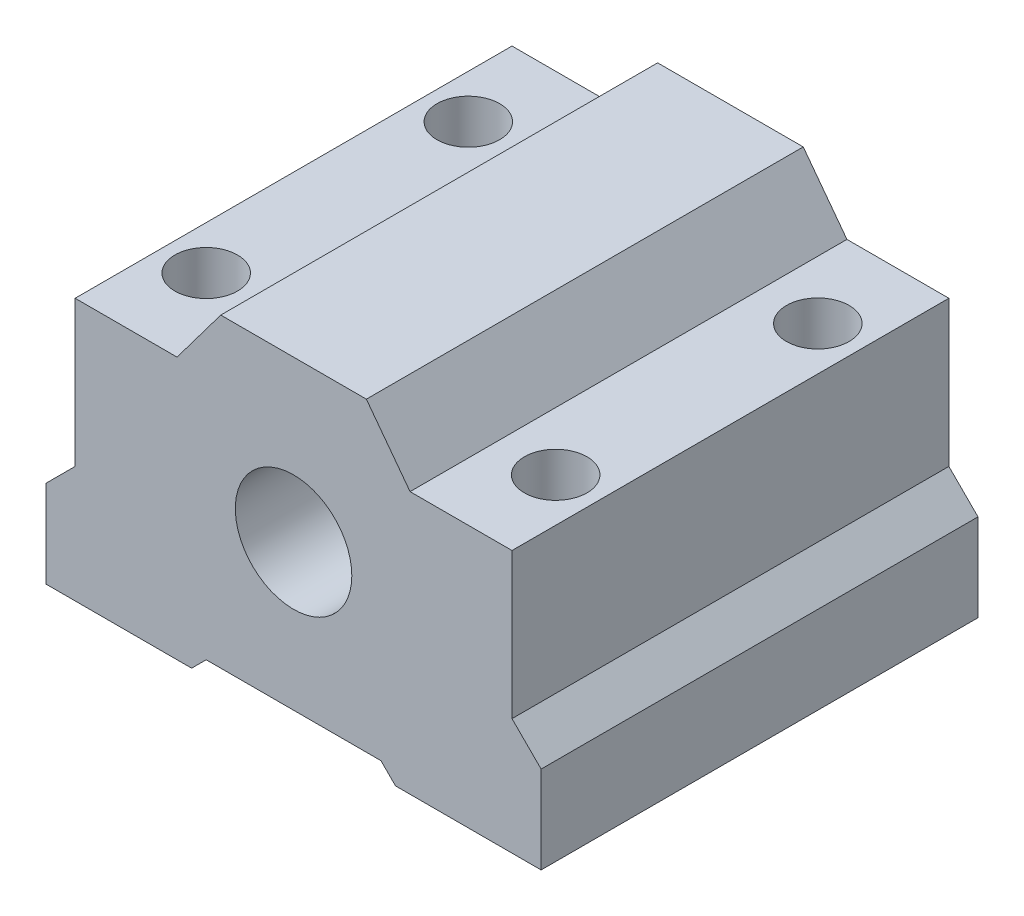
ISO-10303-21;
HEADER;
FILE_DESCRIPTION(('STEP AP214'),'2;1');
FILE_NAME('part.step','',(''),(''),'','','');
FILE_SCHEMA(('AUTOMOTIVE_DESIGN { 1 0 10303 214 1 1 1 1 }'));
ENDSEC;
DATA;
#1=APPLICATION_CONTEXT('core data for automotive mechanical design processes');
#2=APPLICATION_PROTOCOL_DEFINITION('international standard','automotive_design',2000,#1);
#3=PRODUCT_CONTEXT('',#1,'mechanical');
#4=PRODUCT('Part','Part','',(#3));
#5=PRODUCT_RELATED_PRODUCT_CATEGORY('part','',(#4));
#6=PRODUCT_DEFINITION_FORMATION('','',#4);
#7=PRODUCT_DEFINITION_CONTEXT('part definition',#1,'design');
#8=PRODUCT_DEFINITION('design','',#6,#7);
#9=PRODUCT_DEFINITION_SHAPE('','',#8);
#10=(LENGTH_UNIT() NAMED_UNIT(*) SI_UNIT(.MILLI.,.METRE.));
#11=(NAMED_UNIT(*) PLANE_ANGLE_UNIT() SI_UNIT($,.RADIAN.));
#12=(NAMED_UNIT(*) SI_UNIT($,.STERADIAN.) SOLID_ANGLE_UNIT());
#13=UNCERTAINTY_MEASURE_WITH_UNIT(LENGTH_MEASURE(1.E-05),#10,'distance_accuracy_value','');
#14=(GEOMETRIC_REPRESENTATION_CONTEXT(3) GLOBAL_UNCERTAINTY_ASSIGNED_CONTEXT((#13)) GLOBAL_UNIT_ASSIGNED_CONTEXT((#10,
#11,#12)) REPRESENTATION_CONTEXT('',''));
#15=CARTESIAN_POINT('',(0.,0.,0.));
#16=DIRECTION('',(0.,0.,1.));
#17=DIRECTION('',(1.,0.,0.));
#18=AXIS2_PLACEMENT_3D('',#15,#16,#17);
#19=CARTESIAN_POINT('',(0.,0.,30.));
#20=DIRECTION('',(0.,0.,1.));
#21=DIRECTION('',(1.,0.,0.));
#22=AXIS2_PLACEMENT_3D('',#19,#20,#21);
#23=PLANE('',#22);
#24=DIRECTION('',(-0.600000000000001,0.799999999999999,0.));
#25=VECTOR('',#24,1.);
#26=CARTESIAN_POINT('',(5.,11.,29.9999999999999));
#27=LINE('',#26,#25);
#28=CARTESIAN_POINT('',(8.00000000000001,7.,29.9999999999999));
#29=VERTEX_POINT('',#28);
#30=CARTESIAN_POINT('',(5.,11.,29.9999999999999));
#31=VERTEX_POINT('',#30);
#32=EDGE_CURVE('E238',#29,#31,#27,.T.);
#33=ORIENTED_EDGE('',*,*,#32,.T.);
#34=DIRECTION('',(-1.,0.,0.));
#35=VECTOR('',#34,1.);
#36=CARTESIAN_POINT('',(-5.,11.,30.));
#37=LINE('',#36,#35);
#38=CARTESIAN_POINT('',(-5.,11.,30.));
#39=VERTEX_POINT('',#38);
#40=EDGE_CURVE('E125',#31,#39,#37,.T.);
#41=ORIENTED_EDGE('',*,*,#40,.T.);
#42=DIRECTION('',(-0.600000000000001,-0.799999999999999,0.));
#43=VECTOR('',#42,1.);
#44=CARTESIAN_POINT('',(-5.,11.,30.));
#45=LINE('',#44,#43);
#46=CARTESIAN_POINT('',(-8.00000000000001,7.,29.9999999999999));
#47=VERTEX_POINT('',#46);
#48=EDGE_CURVE('E346',#39,#47,#45,.T.);
#49=ORIENTED_EDGE('',*,*,#48,.T.);
#50=DIRECTION('',(-1.,0.,0.));
#51=VECTOR('',#50,1.);
#52=CARTESIAN_POINT('',(-8.00000000000001,7.,29.9999999999999));
#53=LINE('',#52,#51);
#54=CARTESIAN_POINT('',(-15.,7.00000000000003,29.9999999999999));
#55=VERTEX_POINT('',#54);
#56=EDGE_CURVE('E349',#47,#55,#53,.T.);
#57=ORIENTED_EDGE('',*,*,#56,.T.);
#58=DIRECTION('',(0.,-1.,0.));
#59=VECTOR('',#58,1.);
#60=CARTESIAN_POINT('',(-15.,7.00000000000003,29.9999999999999));
#61=LINE('',#60,#59);
#62=CARTESIAN_POINT('',(-15.,-2.99999999999998,30.));
#63=VERTEX_POINT('',#62);
#64=EDGE_CURVE('E352',#55,#63,#61,.T.);
#65=ORIENTED_EDGE('',*,*,#64,.T.);
#66=DIRECTION('',(-0.707106781186547,-0.707106781186548,0.));
#67=VECTOR('',#66,1.);
#68=CARTESIAN_POINT('',(-15.,-2.99999999999998,30.));
#69=LINE('',#68,#67);
#70=CARTESIAN_POINT('',(-17.,-5.,30.));
#71=VERTEX_POINT('',#70);
#72=EDGE_CURVE('E355',#63,#71,#69,.T.);
#73=ORIENTED_EDGE('',*,*,#72,.T.);
#74=DIRECTION('',(0.,-1.,0.));
#75=VECTOR('',#74,1.);
#76=CARTESIAN_POINT('',(-17.,-5.,30.));
#77=LINE('',#76,#75);
#78=CARTESIAN_POINT('',(-17.,-11.,30.));
#79=VERTEX_POINT('',#78);
#80=EDGE_CURVE('E358',#71,#79,#77,.T.);
#81=ORIENTED_EDGE('',*,*,#80,.T.);
#82=DIRECTION('',(1.,0.,0.));
#83=VECTOR('',#82,1.);
#84=CARTESIAN_POINT('',(-17.,-11.,30.));
#85=LINE('',#84,#83);
#86=CARTESIAN_POINT('',(-6.99999999999999,-11.,30.));
#87=VERTEX_POINT('',#86);
#88=EDGE_CURVE('E361',#79,#87,#85,.T.);
#89=ORIENTED_EDGE('',*,*,#88,.T.);
#90=DIRECTION('',(0.707106781186548,0.707106781186547,0.));
#91=VECTOR('',#90,1.);
#92=CARTESIAN_POINT('',(-6.99999999999999,-11.,30.));
#93=LINE('',#92,#91);
#94=CARTESIAN_POINT('',(-5.99999999999999,-10.,30.));
#95=VERTEX_POINT('',#94);
#96=EDGE_CURVE('E364',#87,#95,#93,.T.);
#97=ORIENTED_EDGE('',*,*,#96,.T.);
#98=DIRECTION('',(1.,0.,0.));
#99=VECTOR('',#98,1.);
#100=CARTESIAN_POINT('',(6.00000000000001,-9.99999999999999,30.));
#101=LINE('',#100,#99);
#102=CARTESIAN_POINT('',(6.00000000000001,-9.99999999999999,30.));
#103=VERTEX_POINT('',#102);
#104=EDGE_CURVE('E367',#95,#103,#101,.T.);
#105=ORIENTED_EDGE('',*,*,#104,.T.);
#106=DIRECTION('',(0.707106781186548,-0.707106781186547,0.));
#107=VECTOR('',#106,1.);
#108=CARTESIAN_POINT('',(7.00000000000001,-11.,30.));
#109=LINE('',#108,#107);
#110=CARTESIAN_POINT('',(7.00000000000001,-11.,30.));
#111=VERTEX_POINT('',#110);
#112=EDGE_CURVE('E370',#103,#111,#109,.T.);
#113=ORIENTED_EDGE('',*,*,#112,.T.);
#114=DIRECTION('',(1.,0.,0.));
#115=VECTOR('',#114,1.);
#116=CARTESIAN_POINT('',(16.9999999999999,-11.,30.));
#117=LINE('',#116,#115);
#118=CARTESIAN_POINT('',(16.9999999999999,-11.,30.));
#119=VERTEX_POINT('',#118);
#120=EDGE_CURVE('E373',#111,#119,#117,.T.);
#121=ORIENTED_EDGE('',*,*,#120,.T.);
#122=DIRECTION('',(0.,1.,0.));
#123=VECTOR('',#122,1.);
#124=CARTESIAN_POINT('',(16.9999999999999,-4.99999999999997,30.));
#125=LINE('',#124,#123);
#126=CARTESIAN_POINT('',(16.9999999999999,-4.99999999999997,30.));
#127=VERTEX_POINT('',#126);
#128=EDGE_CURVE('E168',#119,#127,#125,.T.);
#129=ORIENTED_EDGE('',*,*,#128,.T.);
#130=DIRECTION('',(-0.707106781186548,0.707106781186547,0.));
#131=VECTOR('',#130,1.);
#132=CARTESIAN_POINT('',(15.,-2.99999999999997,30.));
#133=LINE('',#132,#131);
#134=CARTESIAN_POINT('',(15.,-2.99999999999997,30.));
#135=VERTEX_POINT('',#134);
#136=EDGE_CURVE('E162',#127,#135,#133,.T.);
#137=ORIENTED_EDGE('',*,*,#136,.T.);
#138=DIRECTION('',(0.,1.,0.));
#139=VECTOR('',#138,1.);
#140=CARTESIAN_POINT('',(15.,7.00000000000003,29.9999999999999));
#141=LINE('',#140,#139);
#142=CARTESIAN_POINT('',(15.,7.00000000000003,29.9999999999999));
#143=VERTEX_POINT('',#142);
#144=EDGE_CURVE('E166',#135,#143,#141,.T.);
#145=ORIENTED_EDGE('',*,*,#144,.T.);
#146=DIRECTION('',(-1.,0.,0.));
#147=VECTOR('',#146,1.);
#148=CARTESIAN_POINT('',(8.00000000000001,7.,29.9999999999999));
#149=LINE('',#148,#147);
#150=EDGE_CURVE('E58',#143,#29,#149,.T.);
#151=ORIENTED_EDGE('',*,*,#150,.T.);
#152=EDGE_LOOP('',(#33,#41,#49,#57,#65,#73,#81,#89,#97,#105,#113,#121,#129,#137,#145,#151));
#153=FACE_BOUND('',#152,.T.);
#154=CARTESIAN_POINT('',(0.,0.,30.));
#155=DIRECTION('',(0.,0.,1.));
#156=DIRECTION('',(1.,0.,0.));
#157=AXIS2_PLACEMENT_3D('',#154,#155,#156);
#158=CIRCLE('',#157,4.);
#159=CARTESIAN_POINT('',(4.00000000000007,0.,30.));
#160=VERTEX_POINT('',#159);
#161=EDGE_CURVE('E196',#160,#160,#158,.T.);
#162=ORIENTED_EDGE('',*,*,#161,.F.);
#163=EDGE_LOOP('',(#162));
#164=FACE_BOUND('',#163,.T.);
#165=ADVANCED_FACE('F38',(#153,#164),#23,.T.);
#166=CARTESIAN_POINT('',(0.,0.,0.));
#167=DIRECTION('',(0.,0.,1.));
#168=DIRECTION('',(1.,0.,0.));
#169=AXIS2_PLACEMENT_3D('',#166,#167,#168);
#170=PLANE('',#169);
#171=DIRECTION('',(-0.600000000000001,0.799999999999999,0.));
#172=VECTOR('',#171,1.);
#173=CARTESIAN_POINT('',(4.99999999999994,11.,-1.38777878078145E-13));
#174=LINE('',#173,#172);
#175=CARTESIAN_POINT('',(7.99999999999994,7.00000000000001,-1.38777878078145E-13));
#176=VERTEX_POINT('',#175);
#177=CARTESIAN_POINT('',(4.99999999999994,11.,-1.38777878078145E-13));
#178=VERTEX_POINT('',#177);
#179=EDGE_CURVE('E191',#176,#178,#174,.T.);
#180=ORIENTED_EDGE('',*,*,#179,.F.);
#181=DIRECTION('',(-1.,0.,0.));
#182=VECTOR('',#181,1.);
#183=CARTESIAN_POINT('',(7.99999999999994,7.00000000000001,-1.38777878078145E-13));
#184=LINE('',#183,#182);
#185=CARTESIAN_POINT('',(14.9999999999999,7.,-1.38777878078145E-13));
#186=VERTEX_POINT('',#185);
#187=EDGE_CURVE('E117',#186,#176,#184,.T.);
#188=ORIENTED_EDGE('',*,*,#187,.F.);
#189=DIRECTION('',(0.,1.,0.));
#190=VECTOR('',#189,1.);
#191=CARTESIAN_POINT('',(14.9999999999999,7.,-1.38777878078145E-13));
#192=LINE('',#191,#190);
#193=CARTESIAN_POINT('',(15.,-3.,0.));
#194=VERTEX_POINT('',#193);
#195=EDGE_CURVE('E111',#194,#186,#192,.T.);
#196=ORIENTED_EDGE('',*,*,#195,.F.);
#197=DIRECTION('',(-0.707106781186548,0.707106781186547,0.));
#198=VECTOR('',#197,1.);
#199=CARTESIAN_POINT('',(15.,-3.,0.));
#200=LINE('',#199,#198);
#201=CARTESIAN_POINT('',(17.,-5.,0.));
#202=VERTEX_POINT('',#201);
#203=EDGE_CURVE('E177',#202,#194,#200,.T.);
#204=ORIENTED_EDGE('',*,*,#203,.F.);
#205=DIRECTION('',(0.,1.,0.));
#206=VECTOR('',#205,1.);
#207=CARTESIAN_POINT('',(17.,-5.,0.));
#208=LINE('',#207,#206);
#209=CARTESIAN_POINT('',(17.,-11.,0.));
#210=VERTEX_POINT('',#209);
#211=EDGE_CURVE('E229',#210,#202,#208,.T.);
#212=ORIENTED_EDGE('',*,*,#211,.F.);
#213=DIRECTION('',(1.,0.,0.));
#214=VECTOR('',#213,1.);
#215=CARTESIAN_POINT('',(17.,-11.,0.));
#216=LINE('',#215,#214);
#217=CARTESIAN_POINT('',(6.99999999999999,-11.,0.));
#218=VERTEX_POINT('',#217);
#219=EDGE_CURVE('E226',#218,#210,#216,.T.);
#220=ORIENTED_EDGE('',*,*,#219,.F.);
#221=DIRECTION('',(0.707106781186548,-0.707106781186547,0.));
#222=VECTOR('',#221,1.);
#223=CARTESIAN_POINT('',(6.99999999999999,-11.,0.));
#224=LINE('',#223,#222);
#225=CARTESIAN_POINT('',(6.00000000000001,-10.,0.));
#226=VERTEX_POINT('',#225);
#227=EDGE_CURVE('E223',#226,#218,#224,.T.);
#228=ORIENTED_EDGE('',*,*,#227,.F.);
#229=DIRECTION('',(1.,0.,0.));
#230=VECTOR('',#229,1.);
#231=CARTESIAN_POINT('',(6.00000000000001,-10.,0.));
#232=LINE('',#231,#230);
#233=CARTESIAN_POINT('',(-6.00000000000001,-9.99999999999998,0.));
#234=VERTEX_POINT('',#233);
#235=EDGE_CURVE('E220',#234,#226,#232,.T.);
#236=ORIENTED_EDGE('',*,*,#235,.F.);
#237=DIRECTION('',(0.707106781186548,0.707106781186547,0.));
#238=VECTOR('',#237,1.);
#239=CARTESIAN_POINT('',(-7.00000000000001,-11.,0.));
#240=LINE('',#239,#238);
#241=CARTESIAN_POINT('',(-7.00000000000001,-11.,0.));
#242=VERTEX_POINT('',#241);
#243=EDGE_CURVE('E217',#242,#234,#240,.T.);
#244=ORIENTED_EDGE('',*,*,#243,.F.);
#245=DIRECTION('',(1.,0.,0.));
#246=VECTOR('',#245,1.);
#247=CARTESIAN_POINT('',(-17.,-11.,0.));
#248=LINE('',#247,#246);
#249=CARTESIAN_POINT('',(-17.,-11.,0.));
#250=VERTEX_POINT('',#249);
#251=EDGE_CURVE('E214',#250,#242,#248,.T.);
#252=ORIENTED_EDGE('',*,*,#251,.F.);
#253=DIRECTION('',(0.,-1.,0.));
#254=VECTOR('',#253,1.);
#255=CARTESIAN_POINT('',(-17.,-5.,0.));
#256=LINE('',#255,#254);
#257=CARTESIAN_POINT('',(-17.,-5.,0.));
#258=VERTEX_POINT('',#257);
#259=EDGE_CURVE('E211',#258,#250,#256,.T.);
#260=ORIENTED_EDGE('',*,*,#259,.F.);
#261=DIRECTION('',(-0.707106781186547,-0.707106781186548,0.));
#262=VECTOR('',#261,1.);
#263=CARTESIAN_POINT('',(-15.,-3.,0.));
#264=LINE('',#263,#262);
#265=CARTESIAN_POINT('',(-15.,-3.,0.));
#266=VERTEX_POINT('',#265);
#267=EDGE_CURVE('E208',#266,#258,#264,.T.);
#268=ORIENTED_EDGE('',*,*,#267,.F.);
#269=DIRECTION('',(0.,-1.,0.));
#270=VECTOR('',#269,1.);
#271=CARTESIAN_POINT('',(-15.0000000000001,7.,-1.38777878078145E-13));
#272=LINE('',#271,#270);
#273=CARTESIAN_POINT('',(-15.0000000000001,7.,-1.38777878078145E-13));
#274=VERTEX_POINT('',#273);
#275=EDGE_CURVE('E205',#274,#266,#272,.T.);
#276=ORIENTED_EDGE('',*,*,#275,.F.);
#277=DIRECTION('',(-1.,0.,0.));
#278=VECTOR('',#277,1.);
#279=CARTESIAN_POINT('',(-8.00000000000008,7.00000000000001,-1.38777878078145E-13));
#280=LINE('',#279,#278);
#281=CARTESIAN_POINT('',(-8.00000000000008,7.00000000000001,-1.38777878078145E-13));
#282=VERTEX_POINT('',#281);
#283=EDGE_CURVE('E202',#282,#274,#280,.T.);
#284=ORIENTED_EDGE('',*,*,#283,.F.);
#285=DIRECTION('',(-0.600000000000001,-0.799999999999999,0.));
#286=VECTOR('',#285,1.);
#287=CARTESIAN_POINT('',(-5.00000000000006,11.,0.));
#288=LINE('',#287,#286);
#289=CARTESIAN_POINT('',(-5.00000000000006,11.,0.));
#290=VERTEX_POINT('',#289);
#291=EDGE_CURVE('E199',#290,#282,#288,.T.);
#292=ORIENTED_EDGE('',*,*,#291,.F.);
#293=DIRECTION('',(-1.,0.,0.));
#294=VECTOR('',#293,1.);
#295=CARTESIAN_POINT('',(-5.00000000000006,11.,0.));
#296=LINE('',#295,#294);
#297=EDGE_CURVE('E195',#178,#290,#296,.T.);
#298=ORIENTED_EDGE('',*,*,#297,.F.);
#299=EDGE_LOOP('',(#180,#188,#196,#204,#212,#220,#228,#236,#244,#252,#260,#268,#276,#284,#292,#298));
#300=FACE_BOUND('',#299,.T.);
#301=CARTESIAN_POINT('',(0.,0.,0.));
#302=DIRECTION('',(0.,0.,1.));
#303=DIRECTION('',(1.,0.,0.));
#304=AXIS2_PLACEMENT_3D('',#301,#302,#303);
#305=CIRCLE('',#304,4.);
#306=CARTESIAN_POINT('',(4.,0.,0.));
#307=VERTEX_POINT('',#306);
#308=EDGE_CURVE('E335',#307,#307,#305,.T.);
#309=ORIENTED_EDGE('',*,*,#308,.T.);
#310=EDGE_LOOP('',(#309));
#311=FACE_BOUND('',#310,.T.);
#312=ADVANCED_FACE('F447',(#300,#311),#170,.F.);
#313=CARTESIAN_POINT('',(5.,11.,29.9999999999999));
#314=DIRECTION('',(-0.799999999999999,-0.600000000000001,0.));
#315=DIRECTION('',(0.600000000000001,-0.799999999999999,0.));
#316=AXIS2_PLACEMENT_3D('',#313,#314,#315);
#317=PLANE('',#316);
#318=ORIENTED_EDGE('',*,*,#179,.T.);
#319=DIRECTION('',(0.,0.,-1.));
#320=VECTOR('',#319,1.);
#321=CARTESIAN_POINT('',(5.,11.,29.9999999999999));
#322=LINE('',#321,#320);
#323=EDGE_CURVE('E11',#31,#178,#322,.T.);
#324=ORIENTED_EDGE('',*,*,#323,.F.);
#325=ORIENTED_EDGE('',*,*,#32,.F.);
#326=DIRECTION('',(0.,0.,-1.));
#327=VECTOR('',#326,1.);
#328=CARTESIAN_POINT('',(8.00000000000001,7.,29.9999999999999));
#329=LINE('',#328,#327);
#330=EDGE_CURVE('E187',#29,#176,#329,.T.);
#331=ORIENTED_EDGE('',*,*,#330,.T.);
#332=EDGE_LOOP('',(#318,#324,#325,#331));
#333=FACE_BOUND('',#332,.T.);
#334=ADVANCED_FACE('F40',(#333),#317,.F.);
#335=CARTESIAN_POINT('',(-5.,11.,30.));
#336=DIRECTION('',(0.,-1.,0.));
#337=DIRECTION('',(1.,0.,0.));
#338=AXIS2_PLACEMENT_3D('',#335,#336,#337);
#339=PLANE('',#338);
#340=ORIENTED_EDGE('',*,*,#297,.T.);
#341=DIRECTION('',(0.,0.,-1.));
#342=VECTOR('',#341,1.);
#343=CARTESIAN_POINT('',(-5.,11.,30.));
#344=LINE('',#343,#342);
#345=EDGE_CURVE('E49',#39,#290,#344,.T.);
#346=ORIENTED_EDGE('',*,*,#345,.F.);
#347=ORIENTED_EDGE('',*,*,#40,.F.);
#348=ORIENTED_EDGE('',*,*,#323,.T.);
#349=EDGE_LOOP('',(#340,#346,#347,#348));
#350=FACE_BOUND('',#349,.T.);
#351=ADVANCED_FACE('F502',(#350),#339,.F.);
#352=CARTESIAN_POINT('',(-5.,11.,30.));
#353=DIRECTION('',(0.799999999999999,-0.600000000000001,0.));
#354=DIRECTION('',(0.600000000000001,0.799999999999999,0.));
#355=AXIS2_PLACEMENT_3D('',#352,#353,#354);
#356=PLANE('',#355);
#357=ORIENTED_EDGE('',*,*,#291,.T.);
#358=DIRECTION('',(0.,0.,-1.));
#359=VECTOR('',#358,1.);
#360=CARTESIAN_POINT('',(-8.00000000000001,7.,29.9999999999999));
#361=LINE('',#360,#359);
#362=EDGE_CURVE('E281',#47,#282,#361,.T.);
#363=ORIENTED_EDGE('',*,*,#362,.F.);
#364=ORIENTED_EDGE('',*,*,#48,.F.);
#365=ORIENTED_EDGE('',*,*,#345,.T.);
#366=EDGE_LOOP('',(#357,#363,#364,#365));
#367=FACE_BOUND('',#366,.T.);
#368=ADVANCED_FACE('F500',(#367),#356,.F.);
#369=CARTESIAN_POINT('',(-8.00000000000001,7.,29.9999999999999));
#370=DIRECTION('',(0.,-1.,0.));
#371=DIRECTION('',(1.,0.,0.));
#372=AXIS2_PLACEMENT_3D('',#369,#370,#371);
#373=PLANE('',#372);
#374=CARTESIAN_POINT('',(-12.,7.00000000000003,6.00000000000001));
#375=DIRECTION('',(0.,-1.,0.));
#376=DIRECTION('',(1.,0.,0.));
#377=AXIS2_PLACEMENT_3D('',#374,#375,#376);
#378=CIRCLE('',#377,2.15);
#379=CARTESIAN_POINT('',(-9.85,7.00000000000003,6.00000000000001));
#380=VERTEX_POINT('',#379);
#381=EDGE_CURVE('E296',#380,#380,#378,.T.);
#382=ORIENTED_EDGE('',*,*,#381,.T.);
#383=EDGE_LOOP('',(#382));
#384=FACE_BOUND('',#383,.T.);
#385=CARTESIAN_POINT('',(-12.0000000000001,7.,24.));
#386=DIRECTION('',(0.,-1.,0.));
#387=DIRECTION('',(1.,0.,0.));
#388=AXIS2_PLACEMENT_3D('',#385,#386,#387);
#389=CIRCLE('',#388,2.15000000000001);
#390=CARTESIAN_POINT('',(-9.85000000000006,7.,24.));
#391=VERTEX_POINT('',#390);
#392=EDGE_CURVE('E292',#391,#391,#389,.T.);
#393=ORIENTED_EDGE('',*,*,#392,.T.);
#394=EDGE_LOOP('',(#393));
#395=FACE_BOUND('',#394,.T.);
#396=ORIENTED_EDGE('',*,*,#283,.T.);
#397=DIRECTION('',(0.,0.,-1.));
#398=VECTOR('',#397,1.);
#399=CARTESIAN_POINT('',(-15.,7.00000000000003,29.9999999999999));
#400=LINE('',#399,#398);
#401=EDGE_CURVE('E277',#55,#274,#400,.T.);
#402=ORIENTED_EDGE('',*,*,#401,.F.);
#403=ORIENTED_EDGE('',*,*,#56,.F.);
#404=ORIENTED_EDGE('',*,*,#362,.T.);
#405=EDGE_LOOP('',(#396,#402,#403,#404));
#406=FACE_BOUND('',#405,.T.);
#407=ADVANCED_FACE('F496',(#384,#395,#406),#373,.F.);
#408=CARTESIAN_POINT('',(-15.,7.00000000000003,29.9999999999999));
#409=DIRECTION('',(1.,0.,0.));
#410=DIRECTION('',(0.,1.,0.));
#411=AXIS2_PLACEMENT_3D('',#408,#409,#410);
#412=PLANE('',#411);
#413=ORIENTED_EDGE('',*,*,#275,.T.);
#414=DIRECTION('',(0.,0.,-1.));
#415=VECTOR('',#414,1.);
#416=CARTESIAN_POINT('',(-15.,-2.99999999999998,30.));
#417=LINE('',#416,#415);
#418=EDGE_CURVE('E273',#63,#266,#417,.T.);
#419=ORIENTED_EDGE('',*,*,#418,.F.);
#420=ORIENTED_EDGE('',*,*,#64,.F.);
#421=ORIENTED_EDGE('',*,*,#401,.T.);
#422=EDGE_LOOP('',(#413,#419,#420,#421));
#423=FACE_BOUND('',#422,.T.);
#424=ADVANCED_FACE('F492',(#423),#412,.F.);
#425=CARTESIAN_POINT('',(-15.,-2.99999999999998,30.));
#426=DIRECTION('',(0.707106781186548,-0.707106781186547,0.));
#427=DIRECTION('',(0.707106781186547,0.707106781186548,0.));
#428=AXIS2_PLACEMENT_3D('',#425,#426,#427);
#429=PLANE('',#428);
#430=ORIENTED_EDGE('',*,*,#267,.T.);
#431=DIRECTION('',(0.,0.,-1.));
#432=VECTOR('',#431,1.);
#433=CARTESIAN_POINT('',(-17.,-5.,30.));
#434=LINE('',#433,#432);
#435=EDGE_CURVE('E269',#71,#258,#434,.T.);
#436=ORIENTED_EDGE('',*,*,#435,.F.);
#437=ORIENTED_EDGE('',*,*,#72,.F.);
#438=ORIENTED_EDGE('',*,*,#418,.T.);
#439=EDGE_LOOP('',(#430,#436,#437,#438));
#440=FACE_BOUND('',#439,.T.);
#441=ADVANCED_FACE('F488',(#440),#429,.F.);
#442=CARTESIAN_POINT('',(-17.,-5.,30.));
#443=DIRECTION('',(1.,0.,0.));
#444=DIRECTION('',(0.,0.,-1.));
#445=AXIS2_PLACEMENT_3D('',#442,#443,#444);
#446=PLANE('',#445);
#447=ORIENTED_EDGE('',*,*,#259,.T.);
#448=DIRECTION('',(0.,0.,-1.));
#449=VECTOR('',#448,1.);
#450=CARTESIAN_POINT('',(-17.,-11.,30.));
#451=LINE('',#450,#449);
#452=EDGE_CURVE('E265',#79,#250,#451,.T.);
#453=ORIENTED_EDGE('',*,*,#452,.F.);
#454=ORIENTED_EDGE('',*,*,#80,.F.);
#455=ORIENTED_EDGE('',*,*,#435,.T.);
#456=EDGE_LOOP('',(#447,#453,#454,#455));
#457=FACE_BOUND('',#456,.T.);
#458=ADVANCED_FACE('F484',(#457),#446,.F.);
#459=CARTESIAN_POINT('',(-17.,-11.,30.));
#460=DIRECTION('',(0.,1.,0.));
#461=DIRECTION('',(-1.,0.,0.));
#462=AXIS2_PLACEMENT_3D('',#459,#460,#461);
#463=PLANE('',#462);
#464=CARTESIAN_POINT('',(-12.,-11.,24.0000000000001));
#465=DIRECTION('',(0.,-1.,0.));
#466=DIRECTION('',(0.,0.,-1.));
#467=AXIS2_PLACEMENT_3D('',#464,#465,#466);
#468=CIRCLE('',#467,2.525);
#469=CARTESIAN_POINT('',(-12.,-11.,21.4750000000001));
#470=VERTEX_POINT('',#469);
#471=EDGE_CURVE('E319',#470,#470,#468,.T.);
#472=ORIENTED_EDGE('',*,*,#471,.F.);
#473=EDGE_LOOP('',(#472));
#474=FACE_BOUND('',#473,.T.);
#475=CARTESIAN_POINT('',(-12.,-11.,6.00000000000014));
#476=DIRECTION('',(0.,-1.,0.));
#477=DIRECTION('',(0.,0.,-1.));
#478=AXIS2_PLACEMENT_3D('',#475,#476,#477);
#479=CIRCLE('',#478,2.525);
#480=CARTESIAN_POINT('',(-12.,-11.,3.47500000000014));
#481=VERTEX_POINT('',#480);
#482=EDGE_CURVE('E323',#481,#481,#479,.T.);
#483=ORIENTED_EDGE('',*,*,#482,.F.);
#484=EDGE_LOOP('',(#483));
#485=FACE_BOUND('',#484,.T.);
#486=ORIENTED_EDGE('',*,*,#251,.T.);
#487=DIRECTION('',(0.,0.,-1.));
#488=VECTOR('',#487,1.);
#489=CARTESIAN_POINT('',(-6.99999999999999,-11.,30.));
#490=LINE('',#489,#488);
#491=EDGE_CURVE('E261',#87,#242,#490,.T.);
#492=ORIENTED_EDGE('',*,*,#491,.F.);
#493=ORIENTED_EDGE('',*,*,#88,.F.);
#494=ORIENTED_EDGE('',*,*,#452,.T.);
#495=EDGE_LOOP('',(#486,#492,#493,#494));
#496=FACE_BOUND('',#495,.T.);
#497=ADVANCED_FACE('F480',(#474,#485,#496),#463,.F.);
#498=CARTESIAN_POINT('',(-6.99999999999999,-11.,30.));
#499=DIRECTION('',(-0.707106781186547,0.707106781186548,0.));
#500=DIRECTION('',(-0.707106781186548,-0.707106781186547,0.));
#501=AXIS2_PLACEMENT_3D('',#498,#499,#500);
#502=PLANE('',#501);
#503=ORIENTED_EDGE('',*,*,#243,.T.);
#504=DIRECTION('',(0.,0.,-1.));
#505=VECTOR('',#504,1.);
#506=CARTESIAN_POINT('',(-5.99999999999999,-10.,30.));
#507=LINE('',#506,#505);
#508=EDGE_CURVE('E257',#95,#234,#507,.T.);
#509=ORIENTED_EDGE('',*,*,#508,.F.);
#510=ORIENTED_EDGE('',*,*,#96,.F.);
#511=ORIENTED_EDGE('',*,*,#491,.T.);
#512=EDGE_LOOP('',(#503,#509,#510,#511));
#513=FACE_BOUND('',#512,.T.);
#514=ADVANCED_FACE('F476',(#513),#502,.F.);
#515=CARTESIAN_POINT('',(6.00000000000001,-9.99999999999999,30.));
#516=DIRECTION('',(0.,1.,0.));
#517=DIRECTION('',(-1.,0.,0.));
#518=AXIS2_PLACEMENT_3D('',#515,#516,#517);
#519=PLANE('',#518);
#520=ORIENTED_EDGE('',*,*,#235,.T.);
#521=DIRECTION('',(0.,0.,-1.));
#522=VECTOR('',#521,1.);
#523=CARTESIAN_POINT('',(6.00000000000001,-9.99999999999999,30.));
#524=LINE('',#523,#522);
#525=EDGE_CURVE('E253',#103,#226,#524,.T.);
#526=ORIENTED_EDGE('',*,*,#525,.F.);
#527=ORIENTED_EDGE('',*,*,#104,.F.);
#528=ORIENTED_EDGE('',*,*,#508,.T.);
#529=EDGE_LOOP('',(#520,#526,#527,#528));
#530=FACE_BOUND('',#529,.T.);
#531=ADVANCED_FACE('F472',(#530),#519,.F.);
#532=CARTESIAN_POINT('',(7.00000000000001,-11.,30.));
#533=DIRECTION('',(0.707106781186547,0.707106781186548,0.));
#534=DIRECTION('',(-0.707106781186548,0.707106781186547,0.));
#535=AXIS2_PLACEMENT_3D('',#532,#533,#534);
#536=PLANE('',#535);
#537=ORIENTED_EDGE('',*,*,#227,.T.);
#538=DIRECTION('',(0.,0.,-1.));
#539=VECTOR('',#538,1.);
#540=CARTESIAN_POINT('',(7.00000000000001,-11.,30.));
#541=LINE('',#540,#539);
#542=EDGE_CURVE('E249',#111,#218,#541,.T.);
#543=ORIENTED_EDGE('',*,*,#542,.F.);
#544=ORIENTED_EDGE('',*,*,#112,.F.);
#545=ORIENTED_EDGE('',*,*,#525,.T.);
#546=EDGE_LOOP('',(#537,#543,#544,#545));
#547=FACE_BOUND('',#546,.T.);
#548=ADVANCED_FACE('F468',(#547),#536,.F.);
#549=CARTESIAN_POINT('',(16.9999999999999,-11.,30.));
#550=DIRECTION('',(0.,1.,0.));
#551=DIRECTION('',(0.,0.,1.));
#552=AXIS2_PLACEMENT_3D('',#549,#550,#551);
#553=PLANE('',#552);
#554=CARTESIAN_POINT('',(12.,-11.,24.));
#555=DIRECTION('',(0.,-1.,0.));
#556=DIRECTION('',(0.,0.,-1.));
#557=AXIS2_PLACEMENT_3D('',#554,#555,#556);
#558=CIRCLE('',#557,2.525);
#559=CARTESIAN_POINT('',(12.,-11.,21.475));
#560=VERTEX_POINT('',#559);
#561=EDGE_CURVE('E327',#560,#560,#558,.T.);
#562=ORIENTED_EDGE('',*,*,#561,.F.);
#563=EDGE_LOOP('',(#562));
#564=FACE_BOUND('',#563,.T.);
#565=CARTESIAN_POINT('',(12.,-11.,6.00000000000001));
#566=DIRECTION('',(0.,-1.,0.));
#567=DIRECTION('',(0.,0.,-1.));
#568=AXIS2_PLACEMENT_3D('',#565,#566,#567);
#569=CIRCLE('',#568,2.525);
#570=CARTESIAN_POINT('',(12.,-11.,3.47500000000001));
#571=VERTEX_POINT('',#570);
#572=EDGE_CURVE('E331',#571,#571,#569,.T.);
#573=ORIENTED_EDGE('',*,*,#572,.F.);
#574=EDGE_LOOP('',(#573));
#575=FACE_BOUND('',#574,.T.);
#576=ORIENTED_EDGE('',*,*,#219,.T.);
#577=DIRECTION('',(0.,0.,-1.));
#578=VECTOR('',#577,1.);
#579=CARTESIAN_POINT('',(16.9999999999999,-11.,30.));
#580=LINE('',#579,#578);
#581=EDGE_CURVE('E245',#119,#210,#580,.T.);
#582=ORIENTED_EDGE('',*,*,#581,.F.);
#583=ORIENTED_EDGE('',*,*,#120,.F.);
#584=ORIENTED_EDGE('',*,*,#542,.T.);
#585=EDGE_LOOP('',(#576,#582,#583,#584));
#586=FACE_BOUND('',#585,.T.);
#587=ADVANCED_FACE('F464',(#564,#575,#586),#553,.F.);
#588=CARTESIAN_POINT('',(16.9999999999999,-4.99999999999997,30.));
#589=DIRECTION('',(-1.,0.,0.));
#590=DIRECTION('',(0.,0.,1.));
#591=AXIS2_PLACEMENT_3D('',#588,#589,#590);
#592=PLANE('',#591);
#593=ORIENTED_EDGE('',*,*,#211,.T.);
#594=DIRECTION('',(0.,0.,-1.));
#595=VECTOR('',#594,1.);
#596=CARTESIAN_POINT('',(16.9999999999999,-4.99999999999997,30.));
#597=LINE('',#596,#595);
#598=EDGE_CURVE('E179',#127,#202,#597,.T.);
#599=ORIENTED_EDGE('',*,*,#598,.F.);
#600=ORIENTED_EDGE('',*,*,#128,.F.);
#601=ORIENTED_EDGE('',*,*,#581,.T.);
#602=EDGE_LOOP('',(#593,#599,#600,#601));
#603=FACE_BOUND('',#602,.T.);
#604=ADVANCED_FACE('F461',(#603),#592,.F.);
#605=CARTESIAN_POINT('',(15.,-2.99999999999997,30.));
#606=DIRECTION('',(-0.707106781186547,-0.707106781186548,0.));
#607=DIRECTION('',(0.707106781186548,-0.707106781186547,0.));
#608=AXIS2_PLACEMENT_3D('',#605,#606,#607);
#609=PLANE('',#608);
#610=ORIENTED_EDGE('',*,*,#203,.T.);
#611=DIRECTION('',(0.,0.,-1.));
#612=VECTOR('',#611,1.);
#613=CARTESIAN_POINT('',(15.,-2.99999999999997,30.));
#614=LINE('',#613,#612);
#615=EDGE_CURVE('E174',#135,#194,#614,.T.);
#616=ORIENTED_EDGE('',*,*,#615,.F.);
#617=ORIENTED_EDGE('',*,*,#136,.F.);
#618=ORIENTED_EDGE('',*,*,#598,.T.);
#619=EDGE_LOOP('',(#610,#616,#617,#618));
#620=FACE_BOUND('',#619,.T.);
#621=ADVANCED_FACE('F175',(#620),#609,.F.);
#622=CARTESIAN_POINT('',(15.,7.00000000000003,29.9999999999999));
#623=DIRECTION('',(-1.,0.,0.));
#624=DIRECTION('',(0.,-1.,0.));
#625=AXIS2_PLACEMENT_3D('',#622,#623,#624);
#626=PLANE('',#625);
#627=ORIENTED_EDGE('',*,*,#195,.T.);
#628=DIRECTION('',(0.,0.,-1.));
#629=VECTOR('',#628,1.);
#630=CARTESIAN_POINT('',(15.,7.00000000000003,29.9999999999999));
#631=LINE('',#630,#629);
#632=EDGE_CURVE('E180',#143,#186,#631,.T.);
#633=ORIENTED_EDGE('',*,*,#632,.F.);
#634=ORIENTED_EDGE('',*,*,#144,.F.);
#635=ORIENTED_EDGE('',*,*,#615,.T.);
#636=EDGE_LOOP('',(#627,#633,#634,#635));
#637=FACE_BOUND('',#636,.T.);
#638=ADVANCED_FACE('F182',(#637),#626,.F.);
#639=CARTESIAN_POINT('',(8.00000000000001,7.,29.9999999999999));
#640=DIRECTION('',(0.,-1.,0.));
#641=DIRECTION('',(0.,0.,-1.));
#642=AXIS2_PLACEMENT_3D('',#639,#640,#641);
#643=PLANE('',#642);
#644=CARTESIAN_POINT('',(12.,7.,5.99999999999987));
#645=DIRECTION('',(0.,-1.,0.));
#646=DIRECTION('',(0.,0.,-1.));
#647=AXIS2_PLACEMENT_3D('',#644,#645,#646);
#648=CIRCLE('',#647,2.15);
#649=CARTESIAN_POINT('',(12.,7.,3.84999999999987));
#650=VERTEX_POINT('',#649);
#651=EDGE_CURVE('E315',#650,#650,#648,.T.);
#652=ORIENTED_EDGE('',*,*,#651,.T.);
#653=EDGE_LOOP('',(#652));
#654=FACE_BOUND('',#653,.T.);
#655=CARTESIAN_POINT('',(11.9999999999999,7.,23.9999999999999));
#656=DIRECTION('',(0.,-1.,0.));
#657=DIRECTION('',(0.,0.,-1.));
#658=AXIS2_PLACEMENT_3D('',#655,#656,#657);
#659=CIRCLE('',#658,2.15);
#660=CARTESIAN_POINT('',(11.9999999999999,7.,21.8499999999999));
#661=VERTEX_POINT('',#660);
#662=EDGE_CURVE('E300',#661,#661,#659,.T.);
#663=ORIENTED_EDGE('',*,*,#662,.T.);
#664=EDGE_LOOP('',(#663));
#665=FACE_BOUND('',#664,.T.);
#666=ORIENTED_EDGE('',*,*,#187,.T.);
#667=ORIENTED_EDGE('',*,*,#330,.F.);
#668=ORIENTED_EDGE('',*,*,#150,.F.);
#669=ORIENTED_EDGE('',*,*,#632,.T.);
#670=EDGE_LOOP('',(#666,#667,#668,#669));
#671=FACE_BOUND('',#670,.T.);
#672=ADVANCED_FACE('F429',(#654,#665,#671),#643,.F.);
#673=CARTESIAN_POINT('',(0.,0.,30.));
#674=DIRECTION('',(0.,0.,-1.));
#675=DIRECTION('',(-1.,0.,0.));
#676=AXIS2_PLACEMENT_3D('',#673,#674,#675);
#677=CYLINDRICAL_SURFACE('',#676,4.);
#678=ORIENTED_EDGE('',*,*,#161,.T.);
#679=EDGE_LOOP('',(#678));
#680=FACE_BOUND('',#679,.T.);
#681=ORIENTED_EDGE('',*,*,#308,.F.);
#682=EDGE_LOOP('',(#681));
#683=FACE_BOUND('',#682,.T.);
#684=ADVANCED_FACE('F432',(#680,#683),#677,.F.);
#685=CARTESIAN_POINT('',(12.,-11.,6.00000000000001));
#686=DIRECTION('',(0.,-1.,0.));
#687=DIRECTION('',(0.,0.,-1.));
#688=AXIS2_PLACEMENT_3D('',#685,#686,#687);
#689=CONICAL_SURFACE('',#688,2.525,0.785398163397448);
#690=CARTESIAN_POINT('',(12.,-10.625,6.00000000000001));
#691=DIRECTION('',(0.,-1.,0.));
#692=DIRECTION('',(0.,0.,-1.));
#693=AXIS2_PLACEMENT_3D('',#690,#691,#692);
#694=CIRCLE('',#693,2.15);
#695=CARTESIAN_POINT('',(12.,-10.625,3.85));
#696=VERTEX_POINT('',#695);
#697=EDGE_CURVE('E42',#696,#696,#694,.F.);
#698=ORIENTED_EDGE('',*,*,#697,.T.);
#699=EDGE_LOOP('',(#698));
#700=FACE_BOUND('',#699,.T.);
#701=ORIENTED_EDGE('',*,*,#572,.T.);
#702=EDGE_LOOP('',(#701));
#703=FACE_BOUND('',#702,.T.);
#704=ADVANCED_FACE('F419',(#700,#703),#689,.F.);
#705=CARTESIAN_POINT('',(12.,-11.,24.));
#706=DIRECTION('',(0.,-1.,0.));
#707=DIRECTION('',(0.,0.,-1.));
#708=AXIS2_PLACEMENT_3D('',#705,#706,#707);
#709=CONICAL_SURFACE('',#708,2.525,0.785398163397448);
#710=CARTESIAN_POINT('',(12.,-10.625,24.));
#711=DIRECTION('',(0.,-1.,0.));
#712=DIRECTION('',(0.,0.,-1.));
#713=AXIS2_PLACEMENT_3D('',#710,#711,#712);
#714=CIRCLE('',#713,2.15);
#715=CARTESIAN_POINT('',(12.,-10.625,21.85));
#716=VERTEX_POINT('',#715);
#717=EDGE_CURVE('E297',#716,#716,#714,.F.);
#718=ORIENTED_EDGE('',*,*,#717,.T.);
#719=EDGE_LOOP('',(#718));
#720=FACE_BOUND('',#719,.T.);
#721=ORIENTED_EDGE('',*,*,#561,.T.);
#722=EDGE_LOOP('',(#721));
#723=FACE_BOUND('',#722,.T.);
#724=ADVANCED_FACE('F554',(#720,#723),#709,.F.);
#725=CARTESIAN_POINT('',(-12.,-11.,6.00000000000014));
#726=DIRECTION('',(0.,-1.,0.));
#727=DIRECTION('',(0.,0.,-1.));
#728=AXIS2_PLACEMENT_3D('',#725,#726,#727);
#729=CONICAL_SURFACE('',#728,2.525,0.785398163397448);
#730=CARTESIAN_POINT('',(-12.,-10.625,6.00000000000014));
#731=DIRECTION('',(0.,-1.,0.));
#732=DIRECTION('',(0.,0.,-1.));
#733=AXIS2_PLACEMENT_3D('',#730,#731,#732);
#734=CIRCLE('',#733,2.15);
#735=CARTESIAN_POINT('',(-12.,-10.625,3.85000000000014));
#736=VERTEX_POINT('',#735);
#737=EDGE_CURVE('E293',#736,#736,#734,.F.);
#738=ORIENTED_EDGE('',*,*,#737,.T.);
#739=EDGE_LOOP('',(#738));
#740=FACE_BOUND('',#739,.T.);
#741=ORIENTED_EDGE('',*,*,#482,.T.);
#742=EDGE_LOOP('',(#741));
#743=FACE_BOUND('',#742,.T.);
#744=ADVANCED_FACE('F559',(#740,#743),#729,.F.);
#745=CARTESIAN_POINT('',(-12.,-11.,24.0000000000001));
#746=DIRECTION('',(0.,-1.,0.));
#747=DIRECTION('',(0.,0.,-1.));
#748=AXIS2_PLACEMENT_3D('',#745,#746,#747);
#749=CONICAL_SURFACE('',#748,2.525,0.785398163397448);
#750=CARTESIAN_POINT('',(-12.,-10.625,24.0000000000001));
#751=DIRECTION('',(0.,-1.,0.));
#752=DIRECTION('',(0.,0.,-1.));
#753=AXIS2_PLACEMENT_3D('',#750,#751,#752);
#754=CIRCLE('',#753,2.15000000000001);
#755=CARTESIAN_POINT('',(-12.,-10.625,21.8500000000001));
#756=VERTEX_POINT('',#755);
#757=EDGE_CURVE('E288',#756,#756,#754,.F.);
#758=ORIENTED_EDGE('',*,*,#757,.T.);
#759=EDGE_LOOP('',(#758));
#760=FACE_BOUND('',#759,.T.);
#761=ORIENTED_EDGE('',*,*,#471,.T.);
#762=EDGE_LOOP('',(#761));
#763=FACE_BOUND('',#762,.T.);
#764=ADVANCED_FACE('F564',(#760,#763),#749,.F.);
#765=CARTESIAN_POINT('',(-12.,19.,24.));
#766=DIRECTION('',(0.,-1.,0.));
#767=DIRECTION('',(1.,0.,0.));
#768=AXIS2_PLACEMENT_3D('',#765,#766,#767);
#769=CYLINDRICAL_SURFACE('',#768,2.15000000000001);
#770=ORIENTED_EDGE('',*,*,#757,.F.);
#771=EDGE_LOOP('',(#770));
#772=FACE_BOUND('',#771,.T.);
#773=ORIENTED_EDGE('',*,*,#392,.F.);
#774=EDGE_LOOP('',(#773));
#775=FACE_BOUND('',#774,.T.);
#776=ADVANCED_FACE('F443',(#772,#775),#769,.F.);
#777=CARTESIAN_POINT('',(-12.,19.,6.00000000000001));
#778=DIRECTION('',(0.,-1.,0.));
#779=DIRECTION('',(1.,0.,0.));
#780=AXIS2_PLACEMENT_3D('',#777,#778,#779);
#781=CYLINDRICAL_SURFACE('',#780,2.15);
#782=ORIENTED_EDGE('',*,*,#737,.F.);
#783=EDGE_LOOP('',(#782));
#784=FACE_BOUND('',#783,.T.);
#785=ORIENTED_EDGE('',*,*,#381,.F.);
#786=EDGE_LOOP('',(#785));
#787=FACE_BOUND('',#786,.T.);
#788=ADVANCED_FACE('F437',(#784,#787),#781,.F.);
#789=CARTESIAN_POINT('',(12.,19.,24.));
#790=DIRECTION('',(0.,-1.,0.));
#791=DIRECTION('',(1.,0.,0.));
#792=AXIS2_PLACEMENT_3D('',#789,#790,#791);
#793=CYLINDRICAL_SURFACE('',#792,2.15);
#794=ORIENTED_EDGE('',*,*,#717,.F.);
#795=EDGE_LOOP('',(#794));
#796=FACE_BOUND('',#795,.T.);
#797=ORIENTED_EDGE('',*,*,#662,.F.);
#798=EDGE_LOOP('',(#797));
#799=FACE_BOUND('',#798,.T.);
#800=ADVANCED_FACE('F425',(#796,#799),#793,.F.);
#801=CARTESIAN_POINT('',(12.,19.,5.99999999999987));
#802=DIRECTION('',(0.,-1.,0.));
#803=DIRECTION('',(1.,0.,0.));
#804=AXIS2_PLACEMENT_3D('',#801,#802,#803);
#805=CYLINDRICAL_SURFACE('',#804,2.15);
#806=ORIENTED_EDGE('',*,*,#697,.F.);
#807=EDGE_LOOP('',(#806));
#808=FACE_BOUND('',#807,.T.);
#809=ORIENTED_EDGE('',*,*,#651,.F.);
#810=EDGE_LOOP('',(#809));
#811=FACE_BOUND('',#810,.T.);
#812=ADVANCED_FACE('F422',(#808,#811),#805,.F.);
#813=CLOSED_SHELL('',(#165,#312,#334,#351,#368,#407,#424,#441,#458,#497,#514,#531,#548,#587,
#604,#621,#638,#672,#684,#704,#724,#744,#764,#776,#788,#800,#812));
#814=MANIFOLD_SOLID_BREP('B2',#813);
#815=ADVANCED_BREP_SHAPE_REPRESENTATION('',(#18,#814),#14);
#816=SHAPE_DEFINITION_REPRESENTATION(#9,#815);
ENDSEC;
END-ISO-10303-21;
